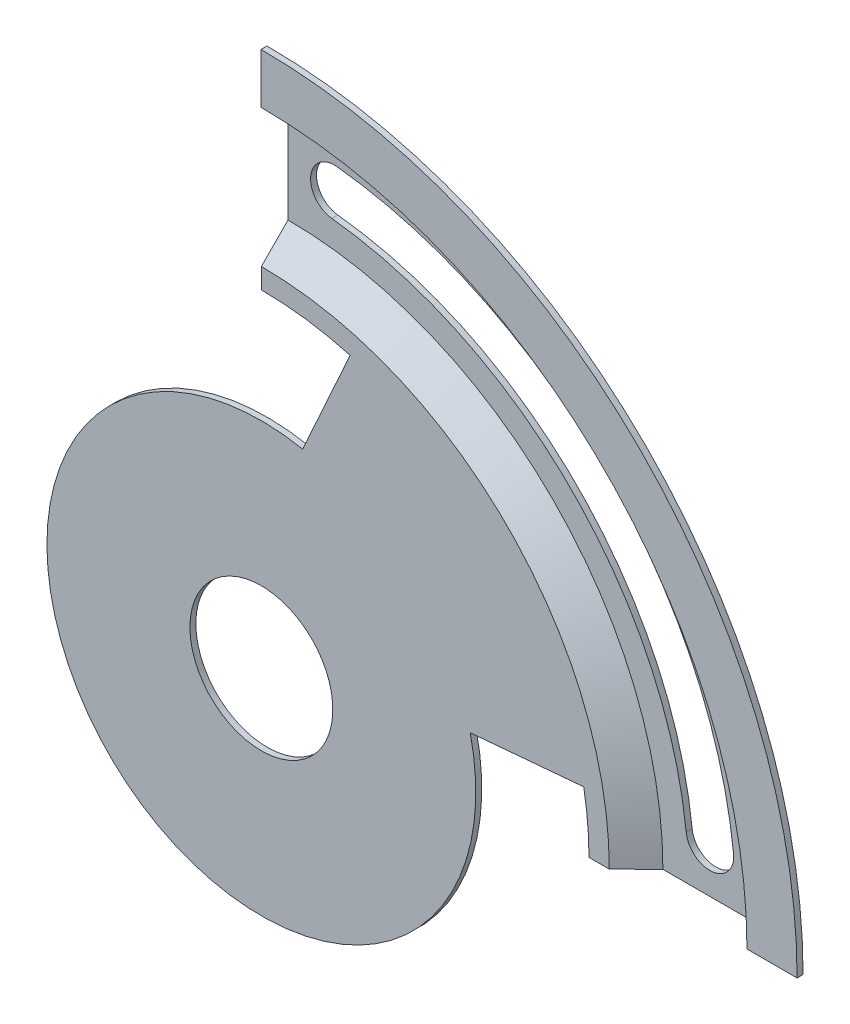
ISO-10303-21;
HEADER;
FILE_DESCRIPTION(('STEP AP214'),'2;1');
FILE_NAME('part.step','',(''),(''),'','','');
FILE_SCHEMA(('AUTOMOTIVE_DESIGN { 1 0 10303 214 1 1 1 1 }'));
ENDSEC;
DATA;
#1=APPLICATION_CONTEXT('core data for automotive mechanical design processes');
#2=APPLICATION_PROTOCOL_DEFINITION('international standard','automotive_design',2000,#1);
#3=PRODUCT_CONTEXT('',#1,'mechanical');
#4=PRODUCT('Part','Part','',(#3));
#5=PRODUCT_RELATED_PRODUCT_CATEGORY('part','',(#4));
#6=PRODUCT_DEFINITION_FORMATION('','',#4);
#7=PRODUCT_DEFINITION_CONTEXT('part definition',#1,'design');
#8=PRODUCT_DEFINITION('design','',#6,#7);
#9=PRODUCT_DEFINITION_SHAPE('','',#8);
#10=(LENGTH_UNIT() NAMED_UNIT(*) SI_UNIT(.MILLI.,.METRE.));
#11=(NAMED_UNIT(*) PLANE_ANGLE_UNIT() SI_UNIT($,.RADIAN.));
#12=(NAMED_UNIT(*) SI_UNIT($,.STERADIAN.) SOLID_ANGLE_UNIT());
#13=UNCERTAINTY_MEASURE_WITH_UNIT(LENGTH_MEASURE(1.E-05),#10,'distance_accuracy_value','');
#14=(GEOMETRIC_REPRESENTATION_CONTEXT(3) GLOBAL_UNCERTAINTY_ASSIGNED_CONTEXT((#13)) GLOBAL_UNIT_ASSIGNED_CONTEXT((#10,
#11,#12)) REPRESENTATION_CONTEXT('',''));
#15=CARTESIAN_POINT('',(0.,0.,0.));
#16=DIRECTION('',(0.,0.,1.));
#17=DIRECTION('',(1.,0.,0.));
#18=AXIS2_PLACEMENT_3D('',#15,#16,#17);
#19=CARTESIAN_POINT('',(-74.2716777212825,74.2716777212822,14.2371794871795));
#20=DIRECTION('',(0.,0.,1.));
#21=DIRECTION('',(1.,0.,0.));
#22=AXIS2_PLACEMENT_3D('',#19,#20,#21);
#23=PLANE('',#22);
#24=CARTESIAN_POINT('',(-74.2716777212822,0.,14.2371794871795));
#25=DIRECTION('',(0.,0.,-1.));
#26=DIRECTION('',(-1.,0.,0.));
#27=AXIS2_PLACEMENT_3D('',#24,#25,#26);
#28=CIRCLE('',#27,77.1120746125061);
#29=CARTESIAN_POINT('',(-74.2716777212825,77.1120746125061,14.2371794871795));
#30=VERTEX_POINT('',#29);
#31=CARTESIAN_POINT('',(2.84039689122381,0.,14.2371794871795));
#32=VERTEX_POINT('',#31);
#33=EDGE_CURVE('E213',#30,#32,#28,.T.);
#34=ORIENTED_EDGE('',*,*,#33,.F.);
#35=DIRECTION('',(0.,-1.,0.));
#36=VECTOR('',#35,1.);
#37=CARTESIAN_POINT('',(-74.2716777212825,74.2716777212822,14.2371794871795));
#38=LINE('',#37,#36);
#39=CARTESIAN_POINT('',(-74.2716777212825,62.940512664491,14.2371794871795));
#40=VERTEX_POINT('',#39);
#41=EDGE_CURVE('E250',#30,#40,#38,.T.);
#42=ORIENTED_EDGE('',*,*,#41,.T.);
#43=CARTESIAN_POINT('',(-74.2716777212822,0.,14.2371794871795));
#44=DIRECTION('',(0.,0.,-1.));
#45=DIRECTION('',(-1.,0.,0.));
#46=AXIS2_PLACEMENT_3D('',#43,#44,#45);
#47=CIRCLE('',#46,62.940512664491);
#48=CARTESIAN_POINT('',(-11.3311650567913,0.,14.2371794871795));
#49=VERTEX_POINT('',#48);
#50=EDGE_CURVE('E211',#40,#49,#47,.T.);
#51=ORIENTED_EDGE('',*,*,#50,.T.);
#52=DIRECTION('',(-1.,0.,0.));
#53=VECTOR('',#52,1.);
#54=CARTESIAN_POINT('',(0.,0.,14.2371794871795));
#55=LINE('',#54,#53);
#56=EDGE_CURVE('E286',#32,#49,#55,.T.);
#57=ORIENTED_EDGE('',*,*,#56,.F.);
#58=EDGE_LOOP('',(#34,#42,#51,#57));
#59=FACE_BOUND('',#58,.T.);
#60=CARTESIAN_POINT('',(-74.2716777212822,0.,14.2371794871795));
#61=DIRECTION('',(0.,0.,1.));
#62=DIRECTION('',(1.,0.,0.));
#63=AXIS2_PLACEMENT_3D('',#60,#61,#62);
#64=CIRCLE('',#63,75.2533607990788);
#65=CARTESIAN_POINT('',(0.549212140260714,8.05622441862127,14.2371794871795));
#66=VERTEX_POINT('',#65);
#67=CARTESIAN_POINT('',(-66.2154533026612,74.820889861543,14.2371794871795));
#68=VERTEX_POINT('',#67);
#69=EDGE_CURVE('E336',#66,#68,#64,.T.);
#70=ORIENTED_EDGE('',*,*,#69,.F.);
#71=CARTESIAN_POINT('',(-3.44347065533563,7.78773298835838,14.2371794871795));
#72=DIRECTION('',(0.,0.,1.));
#73=DIRECTION('',(1.,0.,0.));
#74=AXIS2_PLACEMENT_3D('',#71,#72,#73);
#75=CIRCLE('',#74,4.00170008301169);
#76=CARTESIAN_POINT('',(-7.42119376825707,7.35032883736475,14.2371794871795));
#77=VERTEX_POINT('',#76);
#78=EDGE_CURVE('E331',#66,#77,#75,.F.);
#79=ORIENTED_EDGE('',*,*,#78,.T.);
#80=CARTESIAN_POINT('',(-74.2716777212822,0.,14.2371794871795));
#81=DIRECTION('',(0.,0.,1.));
#82=DIRECTION('',(1.,0.,0.));
#83=AXIS2_PLACEMENT_3D('',#80,#81,#82);
#84=CIRCLE('',#83,67.2533607990788);
#85=CARTESIAN_POINT('',(-66.9213488839177,66.8504839530252,14.2371794871795));
#86=VERTEX_POINT('',#85);
#87=EDGE_CURVE('E339',#77,#86,#84,.T.);
#88=ORIENTED_EDGE('',*,*,#87,.T.);
#89=CARTESIAN_POINT('',(-66.4839447329241,70.8282070659466,14.2371794871795));
#90=DIRECTION('',(0.,0.,1.));
#91=DIRECTION('',(1.,0.,0.));
#92=AXIS2_PLACEMENT_3D('',#89,#90,#91);
#93=CIRCLE('',#92,4.00170008301169);
#94=EDGE_CURVE('E194',#68,#86,#93,.T.);
#95=ORIENTED_EDGE('',*,*,#94,.F.);
#96=EDGE_LOOP('',(#70,#79,#88,#95));
#97=FACE_BOUND('',#96,.T.);
#98=ADVANCED_FACE('F48',(#59,#97),#23,.T.);
#99=CARTESIAN_POINT('',(-74.2716777212825,74.2716777212822,13.2371794871795));
#100=DIRECTION('',(0.,0.,1.));
#101=DIRECTION('',(1.,0.,0.));
#102=AXIS2_PLACEMENT_3D('',#99,#100,#101);
#103=PLANE('',#102);
#104=CARTESIAN_POINT('',(-74.2716777212822,0.,13.2371794871795));
#105=DIRECTION('',(0.,0.,-1.));
#106=DIRECTION('',(-1.,0.,0.));
#107=AXIS2_PLACEMENT_3D('',#104,#105,#106);
#108=CIRCLE('',#107,62.5302247298292);
#109=CARTESIAN_POINT('',(-74.2716777212825,62.5302247298292,13.2371794871795));
#110=VERTEX_POINT('',#109);
#111=CARTESIAN_POINT('',(-11.741452991453,0.,13.2371794871795));
#112=VERTEX_POINT('',#111);
#113=EDGE_CURVE('E225',#110,#112,#108,.T.);
#114=ORIENTED_EDGE('',*,*,#113,.F.);
#115=DIRECTION('',(0.,-1.,0.));
#116=VECTOR('',#115,1.);
#117=CARTESIAN_POINT('',(-74.2716777212825,74.2716777212822,13.2371794871795));
#118=LINE('',#117,#116);
#119=CARTESIAN_POINT('',(-74.2716777212825,77.5302247298292,13.2371794871795));
#120=VERTEX_POINT('',#119);
#121=EDGE_CURVE('E232',#120,#110,#118,.T.);
#122=ORIENTED_EDGE('',*,*,#121,.F.);
#123=CARTESIAN_POINT('',(-74.2716777212822,0.,13.2371794871795));
#124=DIRECTION('',(0.,0.,-1.));
#125=DIRECTION('',(-1.,0.,0.));
#126=AXIS2_PLACEMENT_3D('',#123,#124,#125);
#127=CIRCLE('',#126,77.5302247298292);
#128=CARTESIAN_POINT('',(3.258547008547,0.,13.2371794871795));
#129=VERTEX_POINT('',#128);
#130=EDGE_CURVE('E223',#120,#129,#127,.T.);
#131=ORIENTED_EDGE('',*,*,#130,.T.);
#132=DIRECTION('',(-1.,0.,0.));
#133=VECTOR('',#132,1.);
#134=CARTESIAN_POINT('',(0.,0.,13.2371794871795));
#135=LINE('',#134,#133);
#136=EDGE_CURVE('E268',#129,#112,#135,.T.);
#137=ORIENTED_EDGE('',*,*,#136,.T.);
#138=EDGE_LOOP('',(#114,#122,#131,#137));
#139=FACE_BOUND('',#138,.T.);
#140=CARTESIAN_POINT('',(-3.44347065533563,7.78773298835838,13.2371794871795));
#141=DIRECTION('',(0.,0.,1.));
#142=DIRECTION('',(1.,0.,0.));
#143=AXIS2_PLACEMENT_3D('',#140,#141,#142);
#144=CIRCLE('',#143,4.00170008301169);
#145=CARTESIAN_POINT('',(0.549212140260713,8.05622441862127,13.2371794871795));
#146=VERTEX_POINT('',#145);
#147=CARTESIAN_POINT('',(-7.42119376825708,7.35032883736475,13.2371794871795));
#148=VERTEX_POINT('',#147);
#149=EDGE_CURVE('E13',#146,#148,#144,.F.);
#150=ORIENTED_EDGE('',*,*,#149,.F.);
#151=CARTESIAN_POINT('',(-74.2716777212822,0.,13.2371794871795));
#152=DIRECTION('',(0.,0.,1.));
#153=DIRECTION('',(1.,0.,0.));
#154=AXIS2_PLACEMENT_3D('',#151,#152,#153);
#155=CIRCLE('',#154,75.2533607990788);
#156=CARTESIAN_POINT('',(-66.2154533026612,74.820889861543,13.2371794871795));
#157=VERTEX_POINT('',#156);
#158=EDGE_CURVE('E56',#146,#157,#155,.T.);
#159=ORIENTED_EDGE('',*,*,#158,.T.);
#160=CARTESIAN_POINT('',(-66.4839447329241,70.8282070659466,13.2371794871795));
#161=DIRECTION('',(0.,0.,1.));
#162=DIRECTION('',(1.,0.,0.));
#163=AXIS2_PLACEMENT_3D('',#160,#161,#162);
#164=CIRCLE('',#163,4.00170008301169);
#165=CARTESIAN_POINT('',(-66.9213488839177,66.8504839530252,13.2371794871795));
#166=VERTEX_POINT('',#165);
#167=EDGE_CURVE('E186',#157,#166,#164,.T.);
#168=ORIENTED_EDGE('',*,*,#167,.T.);
#169=CARTESIAN_POINT('',(-74.2716777212822,0.,13.2371794871795));
#170=DIRECTION('',(0.,0.,1.));
#171=DIRECTION('',(1.,0.,0.));
#172=AXIS2_PLACEMENT_3D('',#169,#170,#171);
#173=CIRCLE('',#172,67.2533607990788);
#174=EDGE_CURVE('E181',#148,#166,#173,.T.);
#175=ORIENTED_EDGE('',*,*,#174,.F.);
#176=EDGE_LOOP('',(#150,#159,#168,#175));
#177=FACE_BOUND('',#176,.T.);
#178=ADVANCED_FACE('F199',(#139,#177),#103,.F.);
#179=CARTESIAN_POINT('',(-74.2716777212822,0.,17.7069547573503));
#180=DIRECTION('',(0.,0.,-1.));
#181=DIRECTION('',(-1.,0.,0.));
#182=AXIS2_PLACEMENT_3D('',#179,#180,#181);
#183=CYLINDRICAL_SURFACE('',#182,55.0000521120331);
#184=CARTESIAN_POINT('',(-74.2716777212822,0.,18.7069547573503));
#185=DIRECTION('',(0.,0.,-1.));
#186=DIRECTION('',(-1.,0.,0.));
#187=AXIS2_PLACEMENT_3D('',#184,#185,#186);
#188=CIRCLE('',#187,55.0000521120331);
#189=CARTESIAN_POINT('',(-20.1559547401785,9.82314911618428,18.7069547573502));
#190=VERTEX_POINT('',#189);
#191=CARTESIAN_POINT('',(-19.2716256092491,0.,18.7069547573502));
#192=VERTEX_POINT('',#191);
#193=EDGE_CURVE('E208',#190,#192,#188,.T.);
#194=ORIENTED_EDGE('',*,*,#193,.F.);
#195=DIRECTION('',(0.,0.,-1.));
#196=VECTOR('',#195,1.);
#197=CARTESIAN_POINT('',(-20.1559547401785,9.82314911618428,18.7069547573502));
#198=LINE('',#197,#196);
#199=CARTESIAN_POINT('',(-20.1559547401785,9.82314911618428,17.7069547573502));
#200=VERTEX_POINT('',#199);
#201=EDGE_CURVE('E307',#190,#200,#198,.T.);
#202=ORIENTED_EDGE('',*,*,#201,.T.);
#203=CARTESIAN_POINT('',(-74.2716777212822,0.,17.7069547573503));
#204=DIRECTION('',(0.,0.,-1.));
#205=DIRECTION('',(-1.,0.,0.));
#206=AXIS2_PLACEMENT_3D('',#203,#204,#205);
#207=CIRCLE('',#206,55.0000521120331);
#208=CARTESIAN_POINT('',(-19.2716256092491,0.,17.7069547573502));
#209=VERTEX_POINT('',#208);
#210=EDGE_CURVE('E204',#200,#209,#207,.T.);
#211=ORIENTED_EDGE('',*,*,#210,.T.);
#212=DIRECTION('',(0.,0.,1.));
#213=VECTOR('',#212,1.);
#214=CARTESIAN_POINT('',(-19.2716256092491,0.,0.));
#215=LINE('',#214,#213);
#216=EDGE_CURVE('E295',#209,#192,#215,.T.);
#217=ORIENTED_EDGE('',*,*,#216,.T.);
#218=EDGE_LOOP('',(#194,#202,#211,#217));
#219=FACE_BOUND('',#218,.T.);
#220=ADVANCED_FACE('F358',(#219),#183,.F.);
#221=CARTESIAN_POINT('',(-74.2716777212825,74.2716777212822,17.7069547573503));
#222=DIRECTION('',(0.,0.,1.));
#223=DIRECTION('',(1.,0.,0.));
#224=AXIS2_PLACEMENT_3D('',#221,#222,#223);
#225=PLANE('',#224);
#226=CARTESIAN_POINT('',(-74.2716777212824,55.0000521120331,17.7069547573503));
#227=VERTEX_POINT('',#226);
#228=CARTESIAN_POINT('',(-59.3717429626266,52.9433440246662,17.7069547573503));
#229=VERTEX_POINT('',#228);
#230=EDGE_CURVE('E187',#227,#229,#207,.T.);
#231=ORIENTED_EDGE('',*,*,#230,.F.);
#232=DIRECTION('',(0.,-1.,0.));
#233=VECTOR('',#232,1.);
#234=CARTESIAN_POINT('',(-74.2716777212825,74.2716777212822,17.7069547573503));
#235=LINE('',#234,#233);
#236=CARTESIAN_POINT('',(-74.2716777212824,58.0000521120331,17.7069547573503));
#237=VERTEX_POINT('',#236);
#238=EDGE_CURVE('E262',#237,#227,#235,.T.);
#239=ORIENTED_EDGE('',*,*,#238,.F.);
#240=CARTESIAN_POINT('',(-74.2716777212822,0.,17.7069547573503));
#241=DIRECTION('',(0.,0.,-1.));
#242=DIRECTION('',(-1.,0.,0.));
#243=AXIS2_PLACEMENT_3D('',#240,#241,#242);
#244=CIRCLE('',#243,58.0000521120331);
#245=CARTESIAN_POINT('',(-16.2716256092492,0.,17.7069547573502));
#246=VERTEX_POINT('',#245);
#247=EDGE_CURVE('E227',#237,#246,#244,.T.);
#248=ORIENTED_EDGE('',*,*,#247,.T.);
#249=DIRECTION('',(-1.,0.,0.));
#250=VECTOR('',#249,1.);
#251=CARTESIAN_POINT('',(0.,0.,17.7069547573502));
#252=LINE('',#251,#250);
#253=EDGE_CURVE('E298',#246,#209,#252,.T.);
#254=ORIENTED_EDGE('',*,*,#253,.T.);
#255=ORIENTED_EDGE('',*,*,#210,.F.);
#256=DIRECTION('',(-0.996200421618734,-0.0870902977756767,0.));
#257=VECTOR('',#256,1.);
#258=CARTESIAN_POINT('',(-39.2081045606856,8.15756319077518,17.7069547573503));
#259=LINE('',#258,#257);
#260=CARTESIAN_POINT('',(-39.2081045606856,8.15756319077518,17.7069547573503));
#261=VERTEX_POINT('',#260);
#262=EDGE_CURVE('E311',#200,#261,#259,.T.);
#263=ORIENTED_EDGE('',*,*,#262,.T.);
#264=CARTESIAN_POINT('',(-74.2716777212822,0.,17.7069547573503));
#265=DIRECTION('',(0.,0.,-1.));
#266=DIRECTION('',(-1.,0.,0.));
#267=AXIS2_PLACEMENT_3D('',#264,#265,#266);
#268=CIRCLE('',#267,36.);
#269=CARTESIAN_POINT('',(-67.342979073595,35.3269463023559,17.7069547573503));
#270=VERTEX_POINT('',#269);
#271=EDGE_CURVE('E318',#261,#270,#268,.T.);
#272=ORIENTED_EDGE('',*,*,#271,.T.);
#273=DIRECTION('',(0.412250010118188,0.911070759687498,0.));
#274=VECTOR('',#273,1.);
#275=CARTESIAN_POINT('',(-67.342979073595,35.3269463023559,17.7069547573503));
#276=LINE('',#275,#274);
#277=EDGE_CURVE('E315',#270,#229,#276,.T.);
#278=ORIENTED_EDGE('',*,*,#277,.T.);
#279=EDGE_LOOP('',(#231,#239,#248,#254,#255,#263,#272,#278));
#280=FACE_BOUND('',#279,.T.);
#281=CARTESIAN_POINT('',(-74.2716777212822,0.,17.7069547573503));
#282=DIRECTION('',(0.,0.,-1.));
#283=DIRECTION('',(-1.,0.,0.));
#284=AXIS2_PLACEMENT_3D('',#281,#282,#283);
#285=CIRCLE('',#284,12.);
#286=CARTESIAN_POINT('',(-86.2716777212822,0.,17.7069547573503));
#287=VERTEX_POINT('',#286);
#288=EDGE_CURVE('E328',#287,#287,#285,.T.);
#289=ORIENTED_EDGE('',*,*,#288,.F.);
#290=EDGE_LOOP('',(#289));
#291=FACE_BOUND('',#290,.T.);
#292=ADVANCED_FACE('F374',(#280,#291),#225,.F.);
#293=ORIENTED_EDGE('',*,*,#230,.T.);
#294=DIRECTION('',(0.,0.,-1.));
#295=VECTOR('',#294,1.);
#296=CARTESIAN_POINT('',(-59.3717429626266,52.9433440246662,18.7069547573503));
#297=LINE('',#296,#295);
#298=CARTESIAN_POINT('',(-59.3717429626266,52.9433440246662,18.7069547573503));
#299=VERTEX_POINT('',#298);
#300=EDGE_CURVE('E304',#299,#229,#297,.T.);
#301=ORIENTED_EDGE('',*,*,#300,.F.);
#302=CARTESIAN_POINT('',(-74.2716777212824,55.0000521120331,18.7069547573503));
#303=VERTEX_POINT('',#302);
#304=EDGE_CURVE('E205',#303,#299,#188,.T.);
#305=ORIENTED_EDGE('',*,*,#304,.F.);
#306=DIRECTION('',(0.,0.,1.));
#307=VECTOR('',#306,1.);
#308=CARTESIAN_POINT('',(-74.2716777212824,55.0000521120331,0.));
#309=LINE('',#308,#307);
#310=EDGE_CURVE('E259',#227,#303,#309,.T.);
#311=ORIENTED_EDGE('',*,*,#310,.F.);
#312=EDGE_LOOP('',(#293,#301,#305,#311));
#313=FACE_BOUND('',#312,.T.);
#314=ADVANCED_FACE('F50',(#313),#183,.F.);
#315=CARTESIAN_POINT('',(-74.2716777212825,74.2716777212822,18.7069547573503));
#316=DIRECTION('',(0.,0.,1.));
#317=DIRECTION('',(1.,0.,0.));
#318=AXIS2_PLACEMENT_3D('',#315,#316,#317);
#319=PLANE('',#318);
#320=CARTESIAN_POINT('',(-74.2716777212822,0.,18.7069547573503));
#321=DIRECTION('',(0.,0.,-1.));
#322=DIRECTION('',(-1.,0.,0.));
#323=AXIS2_PLACEMENT_3D('',#320,#321,#322);
#324=CIRCLE('',#323,58.4103400466948);
#325=CARTESIAN_POINT('',(-74.2716777212824,58.4103400466948,18.7069547573503));
#326=VERTEX_POINT('',#325);
#327=CARTESIAN_POINT('',(-15.8613376745874,0.,18.7069547573502));
#328=VERTEX_POINT('',#327);
#329=EDGE_CURVE('E209',#326,#328,#324,.T.);
#330=ORIENTED_EDGE('',*,*,#329,.F.);
#331=DIRECTION('',(0.,-1.,0.));
#332=VECTOR('',#331,1.);
#333=CARTESIAN_POINT('',(-74.2716777212825,74.2716777212822,18.7069547573503));
#334=LINE('',#333,#332);
#335=EDGE_CURVE('E256',#326,#303,#334,.T.);
#336=ORIENTED_EDGE('',*,*,#335,.T.);
#337=ORIENTED_EDGE('',*,*,#304,.T.);
#338=DIRECTION('',(0.412250010118188,0.911070759687498,0.));
#339=VECTOR('',#338,1.);
#340=CARTESIAN_POINT('',(-67.342979073595,35.3269463023559,18.7069547573503));
#341=LINE('',#340,#339);
#342=CARTESIAN_POINT('',(-67.342979073595,35.3269463023559,18.7069547573503));
#343=VERTEX_POINT('',#342);
#344=EDGE_CURVE('E324',#343,#299,#341,.T.);
#345=ORIENTED_EDGE('',*,*,#344,.F.);
#346=CARTESIAN_POINT('',(-74.2716777212822,0.,18.7069547573503));
#347=DIRECTION('',(0.,0.,-1.));
#348=DIRECTION('',(-1.,0.,0.));
#349=AXIS2_PLACEMENT_3D('',#346,#347,#348);
#350=CIRCLE('',#349,36.);
#351=CARTESIAN_POINT('',(-39.2081045606856,8.15756319077518,18.7069547573503));
#352=VERTEX_POINT('',#351);
#353=EDGE_CURVE('E314',#352,#343,#350,.T.);
#354=ORIENTED_EDGE('',*,*,#353,.F.);
#355=DIRECTION('',(-0.996200421618734,-0.0870902977756767,0.));
#356=VECTOR('',#355,1.);
#357=CARTESIAN_POINT('',(-39.2081045606856,8.15756319077518,18.7069547573503));
#358=LINE('',#357,#356);
#359=EDGE_CURVE('E305',#190,#352,#358,.T.);
#360=ORIENTED_EDGE('',*,*,#359,.F.);
#361=ORIENTED_EDGE('',*,*,#193,.T.);
#362=DIRECTION('',(-1.,0.,0.));
#363=VECTOR('',#362,1.);
#364=CARTESIAN_POINT('',(0.,0.,18.7069547573502));
#365=LINE('',#364,#363);
#366=EDGE_CURVE('E292',#328,#192,#365,.T.);
#367=ORIENTED_EDGE('',*,*,#366,.F.);
#368=EDGE_LOOP('',(#330,#336,#337,#345,#354,#360,#361,#367));
#369=FACE_BOUND('',#368,.T.);
#370=CARTESIAN_POINT('',(-74.2716777212822,0.,18.7069547573503));
#371=DIRECTION('',(0.,0.,-1.));
#372=DIRECTION('',(-1.,0.,0.));
#373=AXIS2_PLACEMENT_3D('',#370,#371,#372);
#374=CIRCLE('',#373,12.);
#375=CARTESIAN_POINT('',(-86.2716777212822,0.,18.7069547573503));
#376=VERTEX_POINT('',#375);
#377=EDGE_CURVE('E321',#376,#376,#374,.T.);
#378=ORIENTED_EDGE('',*,*,#377,.T.);
#379=EDGE_LOOP('',(#378));
#380=FACE_BOUND('',#379,.T.);
#381=ADVANCED_FACE('F367',(#369,#380),#319,.T.);
#382=CARTESIAN_POINT('',(-74.2716777212822,0.,14.2371794871795));
#383=DIRECTION('',(0.,0.,-1.));
#384=DIRECTION('',(-1.,0.,0.));
#385=AXIS2_PLACEMENT_3D('',#382,#383,#384);
#386=CONICAL_SURFACE('',#385,62.940512664491,0.792108917917943);
#387=ORIENTED_EDGE('',*,*,#50,.F.);
#388=DIRECTION('',(0.,-0.711836043655105,0.70234567483074));
#389=VECTOR('',#388,1.);
#390=CARTESIAN_POINT('',(-74.2716777212825,75.8000821699319,1.54905684596667));
#391=LINE('',#390,#389);
#392=EDGE_CURVE('E253',#40,#326,#391,.T.);
#393=ORIENTED_EDGE('',*,*,#392,.T.);
#394=ORIENTED_EDGE('',*,*,#329,.T.);
#395=DIRECTION('',(-0.711836043655104,0.,0.702345674830741));
#396=VECTOR('',#395,1.);
#397=CARTESIAN_POINT('',(1.52840444864963,0.,1.54905684596663));
#398=LINE('',#397,#396);
#399=EDGE_CURVE('E289',#49,#328,#398,.T.);
#400=ORIENTED_EDGE('',*,*,#399,.F.);
#401=EDGE_LOOP('',(#387,#393,#394,#400));
#402=FACE_BOUND('',#401,.T.);
#403=ADVANCED_FACE('F365',(#402),#386,.T.);
#404=CARTESIAN_POINT('',(-74.2716777212822,0.,18.7673521049757));
#405=DIRECTION('',(0.,0.,1.));
#406=DIRECTION('',(1.,0.,0.));
#407=AXIS2_PLACEMENT_3D('',#404,#405,#406);
#408=CONICAL_SURFACE('',#407,81.5818498826768,0.778687408876952);
#409=CARTESIAN_POINT('',(-74.2716777212822,0.,18.7673521049757));
#410=DIRECTION('',(0.,0.,-1.));
#411=DIRECTION('',(-1.,0.,0.));
#412=AXIS2_PLACEMENT_3D('',#409,#410,#411);
#413=CIRCLE('',#412,81.5818498826768);
#414=CARTESIAN_POINT('',(-74.2716777212825,81.5818498826768,18.7673521049757));
#415=VERTEX_POINT('',#414);
#416=CARTESIAN_POINT('',(7.31017216139457,0.,18.7673521049756));
#417=VERTEX_POINT('',#416);
#418=EDGE_CURVE('E215',#415,#417,#413,.T.);
#419=ORIENTED_EDGE('',*,*,#418,.F.);
#420=DIRECTION('',(0.,-0.70234567483074,-0.711836043655105));
#421=VECTOR('',#420,1.);
#422=CARTESIAN_POINT('',(-74.2716777212825,68.5929882080535,5.60297986295189));
#423=LINE('',#422,#421);
#424=EDGE_CURVE('E247',#415,#30,#423,.T.);
#425=ORIENTED_EDGE('',*,*,#424,.T.);
#426=ORIENTED_EDGE('',*,*,#33,.T.);
#427=DIRECTION('',(-0.702345674830741,0.,-0.711836043655104));
#428=VECTOR('',#427,1.);
#429=CARTESIAN_POINT('',(-5.67868951322871,0.,5.60297986295186));
#430=LINE('',#429,#428);
#431=EDGE_CURVE('E283',#417,#32,#430,.T.);
#432=ORIENTED_EDGE('',*,*,#431,.F.);
#433=EDGE_LOOP('',(#419,#425,#426,#432));
#434=FACE_BOUND('',#433,.T.);
#435=ADVANCED_FACE('F363',(#434),#408,.F.);
#436=CARTESIAN_POINT('',(-74.2716777212825,74.2716777212822,18.7673521049757));
#437=DIRECTION('',(0.,0.,1.));
#438=DIRECTION('',(1.,0.,0.));
#439=AXIS2_PLACEMENT_3D('',#436,#437,#438);
#440=PLANE('',#439);
#441=CARTESIAN_POINT('',(-74.2716777212822,0.,18.7673521049757));
#442=DIRECTION('',(0.,0.,-1.));
#443=DIRECTION('',(-1.,0.,0.));
#444=AXIS2_PLACEMENT_3D('',#441,#442,#443);
#445=CIRCLE('',#444,90.);
#446=CARTESIAN_POINT('',(-74.2716777212826,90.,18.7673521049757));
#447=VERTEX_POINT('',#446);
#448=CARTESIAN_POINT('',(15.7283222787178,0.,18.7673521049756));
#449=VERTEX_POINT('',#448);
#450=EDGE_CURVE('E217',#447,#449,#445,.T.);
#451=ORIENTED_EDGE('',*,*,#450,.F.);
#452=DIRECTION('',(0.,-1.,0.));
#453=VECTOR('',#452,1.);
#454=CARTESIAN_POINT('',(-74.2716777212825,74.2716777212822,18.7673521049757));
#455=LINE('',#454,#453);
#456=EDGE_CURVE('E244',#447,#415,#455,.T.);
#457=ORIENTED_EDGE('',*,*,#456,.T.);
#458=ORIENTED_EDGE('',*,*,#418,.T.);
#459=DIRECTION('',(-1.,0.,0.));
#460=VECTOR('',#459,1.);
#461=CARTESIAN_POINT('',(0.,0.,18.7673521049756));
#462=LINE('',#461,#460);
#463=EDGE_CURVE('E280',#449,#417,#462,.T.);
#464=ORIENTED_EDGE('',*,*,#463,.F.);
#465=EDGE_LOOP('',(#451,#457,#458,#464));
#466=FACE_BOUND('',#465,.T.);
#467=ADVANCED_FACE('F413',(#466),#440,.T.);
#468=CARTESIAN_POINT('',(-74.2716777212822,0.,17.7069547573503));
#469=DIRECTION('',(0.,0.,-1.));
#470=DIRECTION('',(-1.,0.,0.));
#471=AXIS2_PLACEMENT_3D('',#468,#469,#470);
#472=CYLINDRICAL_SURFACE('',#471,90.);
#473=CARTESIAN_POINT('',(-74.2716777212822,0.,17.7673521049757));
#474=DIRECTION('',(0.,0.,-1.));
#475=DIRECTION('',(-1.,0.,0.));
#476=AXIS2_PLACEMENT_3D('',#473,#474,#475);
#477=CIRCLE('',#476,90.);
#478=CARTESIAN_POINT('',(-74.2716777212826,90.,17.7673521049757));
#479=VERTEX_POINT('',#478);
#480=CARTESIAN_POINT('',(15.7283222787178,0.,17.7673521049756));
#481=VERTEX_POINT('',#480);
#482=EDGE_CURVE('E219',#479,#481,#477,.T.);
#483=ORIENTED_EDGE('',*,*,#482,.F.);
#484=DIRECTION('',(0.,0.,1.));
#485=VECTOR('',#484,1.);
#486=CARTESIAN_POINT('',(-74.2716777212826,90.,0.));
#487=LINE('',#486,#485);
#488=EDGE_CURVE('E241',#479,#447,#487,.T.);
#489=ORIENTED_EDGE('',*,*,#488,.T.);
#490=ORIENTED_EDGE('',*,*,#450,.T.);
#491=DIRECTION('',(0.,0.,1.));
#492=VECTOR('',#491,1.);
#493=CARTESIAN_POINT('',(15.7283222787178,0.,0.));
#494=LINE('',#493,#492);
#495=EDGE_CURVE('E277',#481,#449,#494,.T.);
#496=ORIENTED_EDGE('',*,*,#495,.F.);
#497=EDGE_LOOP('',(#483,#489,#490,#496));
#498=FACE_BOUND('',#497,.T.);
#499=ADVANCED_FACE('F410',(#498),#472,.T.);
#500=CARTESIAN_POINT('',(-74.2716777212825,74.2716777212822,17.7673521049757));
#501=DIRECTION('',(0.,0.,1.));
#502=DIRECTION('',(1.,0.,0.));
#503=AXIS2_PLACEMENT_3D('',#500,#501,#502);
#504=PLANE('',#503);
#505=CARTESIAN_POINT('',(-74.2716777212822,0.,17.7673521049757));
#506=DIRECTION('',(0.,0.,-1.));
#507=DIRECTION('',(-1.,0.,0.));
#508=AXIS2_PLACEMENT_3D('',#505,#506,#507);
#509=CIRCLE('',#508,82.);
#510=CARTESIAN_POINT('',(-74.2716777212825,82.,17.7673521049757));
#511=VERTEX_POINT('',#510);
#512=CARTESIAN_POINT('',(7.72832227871776,0.,17.7673521049756));
#513=VERTEX_POINT('',#512);
#514=EDGE_CURVE('E221',#511,#513,#509,.T.);
#515=ORIENTED_EDGE('',*,*,#514,.F.);
#516=DIRECTION('',(0.,-1.,0.));
#517=VECTOR('',#516,1.);
#518=CARTESIAN_POINT('',(-74.2716777212825,74.2716777212822,17.7673521049757));
#519=LINE('',#518,#517);
#520=EDGE_CURVE('E238',#479,#511,#519,.T.);
#521=ORIENTED_EDGE('',*,*,#520,.F.);
#522=ORIENTED_EDGE('',*,*,#482,.T.);
#523=DIRECTION('',(-1.,0.,0.));
#524=VECTOR('',#523,1.);
#525=CARTESIAN_POINT('',(0.,0.,17.7673521049756));
#526=LINE('',#525,#524);
#527=EDGE_CURVE('E274',#481,#513,#526,.T.);
#528=ORIENTED_EDGE('',*,*,#527,.T.);
#529=EDGE_LOOP('',(#515,#521,#522,#528));
#530=FACE_BOUND('',#529,.T.);
#531=ADVANCED_FACE('F406',(#530),#504,.F.);
#532=CARTESIAN_POINT('',(-74.2716777212822,0.,17.7673521049757));
#533=DIRECTION('',(0.,0.,1.));
#534=DIRECTION('',(1.,0.,0.));
#535=AXIS2_PLACEMENT_3D('',#532,#533,#534);
#536=CONICAL_SURFACE('',#535,82.,0.778687408876953);
#537=ORIENTED_EDGE('',*,*,#130,.F.);
#538=DIRECTION('',(0.,-0.70234567483074,-0.711836043655105));
#539=VECTOR('',#538,1.);
#540=CARTESIAN_POINT('',(-74.2716777212825,69.3048242517086,4.90063418812115));
#541=LINE('',#540,#539);
#542=EDGE_CURVE('E235',#511,#120,#541,.T.);
#543=ORIENTED_EDGE('',*,*,#542,.F.);
#544=ORIENTED_EDGE('',*,*,#514,.T.);
#545=DIRECTION('',(-0.702345674830741,0.,-0.711836043655104));
#546=VECTOR('',#545,1.);
#547=CARTESIAN_POINT('',(-4.96685346957361,0.,4.90063418812112));
#548=LINE('',#547,#546);
#549=EDGE_CURVE('E271',#513,#129,#548,.T.);
#550=ORIENTED_EDGE('',*,*,#549,.T.);
#551=EDGE_LOOP('',(#537,#543,#544,#550));
#552=FACE_BOUND('',#551,.T.);
#553=ADVANCED_FACE('F401',(#552),#536,.T.);
#554=CARTESIAN_POINT('',(-74.2716777212822,0.,13.2371794871795));
#555=DIRECTION('',(0.,0.,-1.));
#556=DIRECTION('',(-1.,0.,0.));
#557=AXIS2_PLACEMENT_3D('',#554,#555,#556);
#558=CONICAL_SURFACE('',#557,62.5302247298292,0.792108917917945);
#559=DIRECTION('',(0.,-0.711836043655105,0.70234567483074));
#560=VECTOR('',#559,1.);
#561=CARTESIAN_POINT('',(-74.2716777212825,75.0977364951011,0.837220802311561));
#562=LINE('',#561,#560);
#563=EDGE_CURVE('E229',#110,#237,#562,.T.);
#564=ORIENTED_EDGE('',*,*,#563,.F.);
#565=ORIENTED_EDGE('',*,*,#113,.T.);
#566=DIRECTION('',(-0.711836043655104,0.,0.702345674830741));
#567=VECTOR('',#566,1.);
#568=CARTESIAN_POINT('',(0.82605877381889,0.,0.837220802311529));
#569=LINE('',#568,#567);
#570=EDGE_CURVE('E265',#112,#246,#569,.T.);
#571=ORIENTED_EDGE('',*,*,#570,.T.);
#572=ORIENTED_EDGE('',*,*,#247,.F.);
#573=EDGE_LOOP('',(#564,#565,#571,#572));
#574=FACE_BOUND('',#573,.T.);
#575=ADVANCED_FACE('F399',(#574),#558,.F.);
#576=CARTESIAN_POINT('',(-74.2716777212825,74.2716777212822,0.));
#577=DIRECTION('',(-1.,0.,0.));
#578=DIRECTION('',(0.,0.,1.));
#579=AXIS2_PLACEMENT_3D('',#576,#577,#578);
#580=PLANE('',#579);
#581=ORIENTED_EDGE('',*,*,#238,.T.);
#582=ORIENTED_EDGE('',*,*,#310,.T.);
#583=ORIENTED_EDGE('',*,*,#335,.F.);
#584=ORIENTED_EDGE('',*,*,#392,.F.);
#585=ORIENTED_EDGE('',*,*,#41,.F.);
#586=ORIENTED_EDGE('',*,*,#424,.F.);
#587=ORIENTED_EDGE('',*,*,#456,.F.);
#588=ORIENTED_EDGE('',*,*,#488,.F.);
#589=ORIENTED_EDGE('',*,*,#520,.T.);
#590=ORIENTED_EDGE('',*,*,#542,.T.);
#591=ORIENTED_EDGE('',*,*,#121,.T.);
#592=ORIENTED_EDGE('',*,*,#563,.T.);
#593=EDGE_LOOP('',(#581,#582,#583,#584,#585,#586,#587,#588,#589,#590,#591,#592));
#594=FACE_BOUND('',#593,.T.);
#595=ADVANCED_FACE('F397',(#594),#580,.T.);
#596=CARTESIAN_POINT('',(0.,0.,0.));
#597=DIRECTION('',(0.,1.,0.));
#598=DIRECTION('',(0.,0.,1.));
#599=AXIS2_PLACEMENT_3D('',#596,#597,#598);
#600=PLANE('',#599);
#601=ORIENTED_EDGE('',*,*,#253,.F.);
#602=ORIENTED_EDGE('',*,*,#570,.F.);
#603=ORIENTED_EDGE('',*,*,#136,.F.);
#604=ORIENTED_EDGE('',*,*,#549,.F.);
#605=ORIENTED_EDGE('',*,*,#527,.F.);
#606=ORIENTED_EDGE('',*,*,#495,.T.);
#607=ORIENTED_EDGE('',*,*,#463,.T.);
#608=ORIENTED_EDGE('',*,*,#431,.T.);
#609=ORIENTED_EDGE('',*,*,#56,.T.);
#610=ORIENTED_EDGE('',*,*,#399,.T.);
#611=ORIENTED_EDGE('',*,*,#366,.T.);
#612=ORIENTED_EDGE('',*,*,#216,.F.);
#613=EDGE_LOOP('',(#601,#602,#603,#604,#605,#606,#607,#608,#609,#610,#611,#612));
#614=FACE_BOUND('',#613,.T.);
#615=ADVANCED_FACE('F447',(#614),#600,.F.);
#616=CARTESIAN_POINT('',(-74.2716777212822,0.,18.7069547573503));
#617=DIRECTION('',(0.,0.,-1.));
#618=DIRECTION('',(-1.,0.,0.));
#619=AXIS2_PLACEMENT_3D('',#616,#617,#618);
#620=CYLINDRICAL_SURFACE('',#619,36.);
#621=ORIENTED_EDGE('',*,*,#271,.F.);
#622=DIRECTION('',(0.,0.,-1.));
#623=VECTOR('',#622,1.);
#624=CARTESIAN_POINT('',(-39.2081045606856,8.15756319077518,18.7069547573503));
#625=LINE('',#624,#623);
#626=EDGE_CURVE('E301',#352,#261,#625,.T.);
#627=ORIENTED_EDGE('',*,*,#626,.F.);
#628=ORIENTED_EDGE('',*,*,#353,.T.);
#629=DIRECTION('',(0.,0.,-1.));
#630=VECTOR('',#629,1.);
#631=CARTESIAN_POINT('',(-67.342979073595,35.3269463023559,18.7069547573503));
#632=LINE('',#631,#630);
#633=EDGE_CURVE('E302',#343,#270,#632,.T.);
#634=ORIENTED_EDGE('',*,*,#633,.T.);
#635=EDGE_LOOP('',(#621,#627,#628,#634));
#636=FACE_BOUND('',#635,.T.);
#637=ADVANCED_FACE('F456',(#636),#620,.T.);
#638=CARTESIAN_POINT('',(-39.2081045606856,8.15756319077518,18.7069547573503));
#639=DIRECTION('',(0.0870902977756767,-0.996200421618734,0.));
#640=DIRECTION('',(0.996200421618734,0.0870902977756767,0.));
#641=AXIS2_PLACEMENT_3D('',#638,#639,#640);
#642=PLANE('',#641);
#643=ORIENTED_EDGE('',*,*,#262,.F.);
#644=ORIENTED_EDGE('',*,*,#201,.F.);
#645=ORIENTED_EDGE('',*,*,#359,.T.);
#646=ORIENTED_EDGE('',*,*,#626,.T.);
#647=EDGE_LOOP('',(#643,#644,#645,#646));
#648=FACE_BOUND('',#647,.T.);
#649=ADVANCED_FACE('F453',(#648),#642,.T.);
#650=CARTESIAN_POINT('',(-67.342979073595,35.3269463023559,18.7069547573503));
#651=DIRECTION('',(-0.911070759687498,0.412250010118188,0.));
#652=DIRECTION('',(-0.412250010118188,-0.911070759687498,0.));
#653=AXIS2_PLACEMENT_3D('',#650,#651,#652);
#654=PLANE('',#653);
#655=ORIENTED_EDGE('',*,*,#277,.F.);
#656=ORIENTED_EDGE('',*,*,#633,.F.);
#657=ORIENTED_EDGE('',*,*,#344,.T.);
#658=ORIENTED_EDGE('',*,*,#300,.T.);
#659=EDGE_LOOP('',(#655,#656,#657,#658));
#660=FACE_BOUND('',#659,.T.);
#661=ADVANCED_FACE('F384',(#660),#654,.T.);
#662=CARTESIAN_POINT('',(-74.2716777212822,0.,18.7069547573503));
#663=DIRECTION('',(0.,0.,-1.));
#664=DIRECTION('',(-1.,0.,0.));
#665=AXIS2_PLACEMENT_3D('',#662,#663,#664);
#666=CYLINDRICAL_SURFACE('',#665,12.);
#667=ORIENTED_EDGE('',*,*,#377,.F.);
#668=EDGE_LOOP('',(#667));
#669=FACE_BOUND('',#668,.T.);
#670=ORIENTED_EDGE('',*,*,#288,.T.);
#671=EDGE_LOOP('',(#670));
#672=FACE_BOUND('',#671,.T.);
#673=ADVANCED_FACE('F381',(#669,#672),#666,.F.);
#674=CARTESIAN_POINT('',(-3.44347065533563,7.78773298835838,18.7673521049757));
#675=DIRECTION('',(0.,0.,-1.));
#676=DIRECTION('',(-1.,0.,0.));
#677=AXIS2_PLACEMENT_3D('',#674,#675,#676);
#678=CYLINDRICAL_SURFACE('',#677,4.00170008301169);
#679=DIRECTION('',(0.,0.,-1.));
#680=VECTOR('',#679,1.);
#681=CARTESIAN_POINT('',(0.549212140260715,8.05622441862127,18.7673521049757));
#682=LINE('',#681,#680);
#683=EDGE_CURVE('E341',#66,#146,#682,.T.);
#684=ORIENTED_EDGE('',*,*,#683,.T.);
#685=ORIENTED_EDGE('',*,*,#149,.T.);
#686=DIRECTION('',(0.,0.,-1.));
#687=VECTOR('',#686,1.);
#688=CARTESIAN_POINT('',(-7.42119376825707,7.35032883736475,18.7673521049757));
#689=LINE('',#688,#687);
#690=EDGE_CURVE('E68',#77,#148,#689,.T.);
#691=ORIENTED_EDGE('',*,*,#690,.F.);
#692=ORIENTED_EDGE('',*,*,#78,.F.);
#693=EDGE_LOOP('',(#684,#685,#691,#692));
#694=FACE_BOUND('',#693,.T.);
#695=ADVANCED_FACE('F347',(#694),#678,.F.);
#696=CARTESIAN_POINT('',(-74.2716777212822,0.,18.7673521049757));
#697=DIRECTION('',(0.,0.,-1.));
#698=DIRECTION('',(-1.,0.,0.));
#699=AXIS2_PLACEMENT_3D('',#696,#697,#698);
#700=CYLINDRICAL_SURFACE('',#699,75.2533607990788);
#701=ORIENTED_EDGE('',*,*,#69,.T.);
#702=DIRECTION('',(0.,0.,-1.));
#703=VECTOR('',#702,1.);
#704=CARTESIAN_POINT('',(-66.2154533026612,74.820889861543,18.7673521049757));
#705=LINE('',#704,#703);
#706=EDGE_CURVE('E196',#68,#157,#705,.T.);
#707=ORIENTED_EDGE('',*,*,#706,.T.);
#708=ORIENTED_EDGE('',*,*,#158,.F.);
#709=ORIENTED_EDGE('',*,*,#683,.F.);
#710=EDGE_LOOP('',(#701,#707,#708,#709));
#711=FACE_BOUND('',#710,.T.);
#712=ADVANCED_FACE('F350',(#711),#700,.F.);
#713=CARTESIAN_POINT('',(-66.4839447329241,70.8282070659466,18.7673521049757));
#714=DIRECTION('',(0.,0.,-1.));
#715=DIRECTION('',(-1.,0.,0.));
#716=AXIS2_PLACEMENT_3D('',#713,#714,#715);
#717=CYLINDRICAL_SURFACE('',#716,4.00170008301169);
#718=ORIENTED_EDGE('',*,*,#94,.T.);
#719=DIRECTION('',(0.,0.,-1.));
#720=VECTOR('',#719,1.);
#721=CARTESIAN_POINT('',(-66.9213488839177,66.8504839530252,18.7673521049757));
#722=LINE('',#721,#720);
#723=EDGE_CURVE('E63',#86,#166,#722,.T.);
#724=ORIENTED_EDGE('',*,*,#723,.T.);
#725=ORIENTED_EDGE('',*,*,#167,.F.);
#726=ORIENTED_EDGE('',*,*,#706,.F.);
#727=EDGE_LOOP('',(#718,#724,#725,#726));
#728=FACE_BOUND('',#727,.T.);
#729=ADVANCED_FACE('F190',(#728),#717,.F.);
#730=CARTESIAN_POINT('',(-74.2716777212822,0.,18.7673521049757));
#731=DIRECTION('',(0.,0.,-1.));
#732=DIRECTION('',(-1.,0.,0.));
#733=AXIS2_PLACEMENT_3D('',#730,#731,#732);
#734=CYLINDRICAL_SURFACE('',#733,67.2533607990788);
#735=ORIENTED_EDGE('',*,*,#690,.T.);
#736=ORIENTED_EDGE('',*,*,#174,.T.);
#737=ORIENTED_EDGE('',*,*,#723,.F.);
#738=ORIENTED_EDGE('',*,*,#87,.F.);
#739=EDGE_LOOP('',(#735,#736,#737,#738));
#740=FACE_BOUND('',#739,.T.);
#741=ADVANCED_FACE('F182',(#740),#734,.T.);
#742=CLOSED_SHELL('',(#98,#178,#220,#292,#314,#381,#403,#435,#467,#499,#531,#553,#575,#595,#615,
#637,#649,#661,#673,#695,#712,#729,#741));
#743=MANIFOLD_SOLID_BREP('B2',#742);
#744=ADVANCED_BREP_SHAPE_REPRESENTATION('',(#18,#743),#14);
#745=SHAPE_DEFINITION_REPRESENTATION(#9,#744);
ENDSEC;
END-ISO-10303-21;
